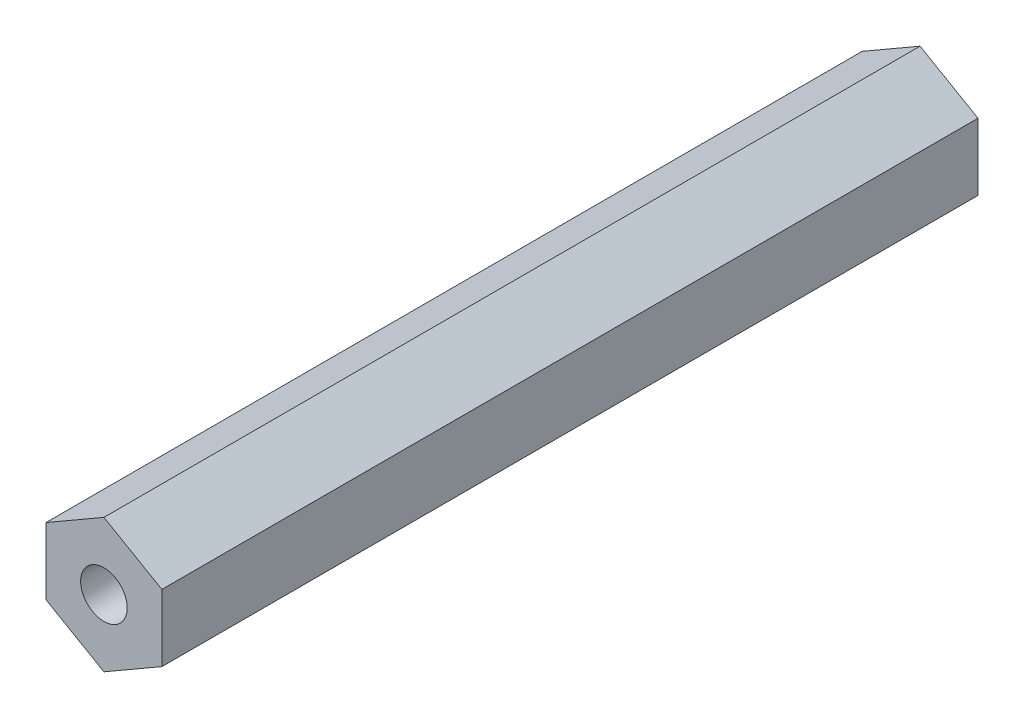
ISO-10303-21;
HEADER;
FILE_DESCRIPTION(('STEP AP214'),'2;1');
FILE_NAME('part.step','',(''),(''),'','','');
FILE_SCHEMA(('AUTOMOTIVE_DESIGN { 1 0 10303 214 1 1 1 1 }'));
ENDSEC;
DATA;
#1=APPLICATION_CONTEXT('core data for automotive mechanical design processes');
#2=APPLICATION_PROTOCOL_DEFINITION('international standard','automotive_design',2000,#1);
#3=PRODUCT_CONTEXT('',#1,'mechanical');
#4=PRODUCT('Part','Part','',(#3));
#5=PRODUCT_RELATED_PRODUCT_CATEGORY('part','',(#4));
#6=PRODUCT_DEFINITION_FORMATION('','',#4);
#7=PRODUCT_DEFINITION_CONTEXT('part definition',#1,'design');
#8=PRODUCT_DEFINITION('design','',#6,#7);
#9=PRODUCT_DEFINITION_SHAPE('','',#8);
#10=(LENGTH_UNIT() NAMED_UNIT(*) SI_UNIT(.MILLI.,.METRE.));
#11=(NAMED_UNIT(*) PLANE_ANGLE_UNIT() SI_UNIT($,.RADIAN.));
#12=(NAMED_UNIT(*) SI_UNIT($,.STERADIAN.) SOLID_ANGLE_UNIT());
#13=UNCERTAINTY_MEASURE_WITH_UNIT(LENGTH_MEASURE(1.E-05),#10,'distance_accuracy_value','');
#14=(GEOMETRIC_REPRESENTATION_CONTEXT(3) GLOBAL_UNCERTAINTY_ASSIGNED_CONTEXT((#13)) GLOBAL_UNIT_ASSIGNED_CONTEXT((#10,
#11,#12)) REPRESENTATION_CONTEXT('',''));
#15=CARTESIAN_POINT('',(0.,0.,0.));
#16=DIRECTION('',(0.,0.,1.));
#17=DIRECTION('',(1.,0.,0.));
#18=AXIS2_PLACEMENT_3D('',#15,#16,#17);
#19=CARTESIAN_POINT('',(6.34999999999999,3.66617420935413,44.73702));
#20=DIRECTION('',(-0.5,-0.866025403784439,0.));
#21=DIRECTION('',(0.866025403784439,-0.5,0.));
#22=AXIS2_PLACEMENT_3D('',#19,#20,#21);
#23=PLANE('',#22);
#24=DIRECTION('',(0.,0.,-1.));
#25=VECTOR('',#24,1.);
#26=CARTESIAN_POINT('',(6.34999999999999,3.66617420935413,44.73702));
#27=LINE('',#26,#25);
#28=CARTESIAN_POINT('',(6.34999999999999,3.66617420935413,44.73702));
#29=VERTEX_POINT('',#28);
#30=CARTESIAN_POINT('',(6.34999999999999,3.66617420935413,-44.73702));
#31=VERTEX_POINT('',#30);
#32=EDGE_CURVE('E145',#29,#31,#27,.T.);
#33=ORIENTED_EDGE('',*,*,#32,.T.);
#34=DIRECTION('',(-0.866025403784438,0.5,0.));
#35=VECTOR('',#34,1.);
#36=CARTESIAN_POINT('',(6.34999999999999,3.66617420935413,-44.73702));
#37=LINE('',#36,#35);
#38=CARTESIAN_POINT('',(0.,7.33234841870825,-44.73702));
#39=VERTEX_POINT('',#38);
#40=EDGE_CURVE('E117',#31,#39,#37,.T.);
#41=ORIENTED_EDGE('',*,*,#40,.T.);
#42=DIRECTION('',(0.,0.,-1.));
#43=VECTOR('',#42,1.);
#44=CARTESIAN_POINT('',(0.,7.33234841870825,44.73702));
#45=LINE('',#44,#43);
#46=CARTESIAN_POINT('',(0.,7.33234841870825,44.73702));
#47=VERTEX_POINT('',#46);
#48=EDGE_CURVE('E11',#47,#39,#45,.T.);
#49=ORIENTED_EDGE('',*,*,#48,.F.);
#50=DIRECTION('',(-0.866025403784438,0.5,0.));
#51=VECTOR('',#50,1.);
#52=CARTESIAN_POINT('',(6.34999999999999,3.66617420935413,44.73702));
#53=LINE('',#52,#51);
#54=EDGE_CURVE('E135',#29,#47,#53,.T.);
#55=ORIENTED_EDGE('',*,*,#54,.F.);
#56=EDGE_LOOP('',(#33,#41,#49,#55));
#57=FACE_BOUND('',#56,.T.);
#58=ADVANCED_FACE('F41',(#57),#23,.F.);
#59=CARTESIAN_POINT('',(0.,7.33234841870825,44.73702));
#60=DIRECTION('',(0.5,-0.866025403784439,0.));
#61=DIRECTION('',(0.866025403784439,0.5,0.));
#62=AXIS2_PLACEMENT_3D('',#59,#60,#61);
#63=PLANE('',#62);
#64=ORIENTED_EDGE('',*,*,#48,.T.);
#65=DIRECTION('',(-0.866025403784439,-0.5,0.));
#66=VECTOR('',#65,1.);
#67=CARTESIAN_POINT('',(0.,7.33234841870825,-44.73702));
#68=LINE('',#67,#66);
#69=CARTESIAN_POINT('',(-6.35,3.66617420935413,-44.73702));
#70=VERTEX_POINT('',#69);
#71=EDGE_CURVE('E120',#39,#70,#68,.T.);
#72=ORIENTED_EDGE('',*,*,#71,.T.);
#73=DIRECTION('',(0.,0.,-1.));
#74=VECTOR('',#73,1.);
#75=CARTESIAN_POINT('',(-6.35,3.66617420935413,44.73702));
#76=LINE('',#75,#74);
#77=CARTESIAN_POINT('',(-6.35,3.66617420935413,44.73702));
#78=VERTEX_POINT('',#77);
#79=EDGE_CURVE('E48',#78,#70,#76,.T.);
#80=ORIENTED_EDGE('',*,*,#79,.F.);
#81=DIRECTION('',(-0.866025403784439,-0.5,0.));
#82=VECTOR('',#81,1.);
#83=CARTESIAN_POINT('',(0.,7.33234841870825,44.73702));
#84=LINE('',#83,#82);
#85=EDGE_CURVE('E137',#47,#78,#84,.T.);
#86=ORIENTED_EDGE('',*,*,#85,.F.);
#87=EDGE_LOOP('',(#64,#72,#80,#86));
#88=FACE_BOUND('',#87,.T.);
#89=ADVANCED_FACE('F165',(#88),#63,.F.);
#90=CARTESIAN_POINT('',(-6.35,3.66617420935413,44.73702));
#91=DIRECTION('',(1.,0.,0.));
#92=DIRECTION('',(0.,0.,-1.));
#93=AXIS2_PLACEMENT_3D('',#90,#91,#92);
#94=PLANE('',#93);
#95=ORIENTED_EDGE('',*,*,#79,.T.);
#96=DIRECTION('',(0.,-1.,0.));
#97=VECTOR('',#96,1.);
#98=CARTESIAN_POINT('',(-6.35,3.66617420935413,-44.73702));
#99=LINE('',#98,#97);
#100=CARTESIAN_POINT('',(-6.35,-3.66617420935413,-44.73702));
#101=VERTEX_POINT('',#100);
#102=EDGE_CURVE('E123',#70,#101,#99,.T.);
#103=ORIENTED_EDGE('',*,*,#102,.T.);
#104=DIRECTION('',(0.,0.,-1.));
#105=VECTOR('',#104,1.);
#106=CARTESIAN_POINT('',(-6.35,-3.66617420935413,44.73702));
#107=LINE('',#106,#105);
#108=CARTESIAN_POINT('',(-6.35,-3.66617420935413,44.73702));
#109=VERTEX_POINT('',#108);
#110=EDGE_CURVE('E151',#109,#101,#107,.T.);
#111=ORIENTED_EDGE('',*,*,#110,.F.);
#112=DIRECTION('',(0.,-1.,0.));
#113=VECTOR('',#112,1.);
#114=CARTESIAN_POINT('',(-6.35,3.66617420935413,44.73702));
#115=LINE('',#114,#113);
#116=EDGE_CURVE('E139',#78,#109,#115,.T.);
#117=ORIENTED_EDGE('',*,*,#116,.F.);
#118=EDGE_LOOP('',(#95,#103,#111,#117));
#119=FACE_BOUND('',#118,.T.);
#120=ADVANCED_FACE('F156',(#119),#94,.F.);
#121=CARTESIAN_POINT('',(-6.35,-3.66617420935413,44.73702));
#122=DIRECTION('',(0.5,0.866025403784439,0.));
#123=DIRECTION('',(-0.866025403784439,0.5,0.));
#124=AXIS2_PLACEMENT_3D('',#121,#122,#123);
#125=PLANE('',#124);
#126=ORIENTED_EDGE('',*,*,#110,.T.);
#127=DIRECTION('',(0.866025403784439,-0.5,0.));
#128=VECTOR('',#127,1.);
#129=CARTESIAN_POINT('',(-6.35,-3.66617420935413,-44.73702));
#130=LINE('',#129,#128);
#131=CARTESIAN_POINT('',(0.,-7.33234841870825,-44.73702));
#132=VERTEX_POINT('',#131);
#133=EDGE_CURVE('E126',#101,#132,#130,.T.);
#134=ORIENTED_EDGE('',*,*,#133,.T.);
#135=DIRECTION('',(0.,0.,-1.));
#136=VECTOR('',#135,1.);
#137=CARTESIAN_POINT('',(0.,-7.33234841870825,44.73702));
#138=LINE('',#137,#136);
#139=CARTESIAN_POINT('',(0.,-7.33234841870825,44.73702));
#140=VERTEX_POINT('',#139);
#141=EDGE_CURVE('E149',#140,#132,#138,.T.);
#142=ORIENTED_EDGE('',*,*,#141,.F.);
#143=DIRECTION('',(0.866025403784439,-0.5,0.));
#144=VECTOR('',#143,1.);
#145=CARTESIAN_POINT('',(-6.35,-3.66617420935413,44.73702));
#146=LINE('',#145,#144);
#147=EDGE_CURVE('E141',#109,#140,#146,.T.);
#148=ORIENTED_EDGE('',*,*,#147,.F.);
#149=EDGE_LOOP('',(#126,#134,#142,#148));
#150=FACE_BOUND('',#149,.T.);
#151=ADVANCED_FACE('F176',(#150),#125,.F.);
#152=CARTESIAN_POINT('',(0.,-7.33234841870825,44.73702));
#153=DIRECTION('',(-0.5,0.866025403784439,0.));
#154=DIRECTION('',(-0.866025403784439,-0.5,0.));
#155=AXIS2_PLACEMENT_3D('',#152,#153,#154);
#156=PLANE('',#155);
#157=ORIENTED_EDGE('',*,*,#141,.T.);
#158=DIRECTION('',(0.866025403784439,0.5,0.));
#159=VECTOR('',#158,1.);
#160=CARTESIAN_POINT('',(0.,-7.33234841870825,-44.73702));
#161=LINE('',#160,#159);
#162=CARTESIAN_POINT('',(6.34999999999999,-3.66617420935413,-44.73702));
#163=VERTEX_POINT('',#162);
#164=EDGE_CURVE('E129',#132,#163,#161,.T.);
#165=ORIENTED_EDGE('',*,*,#164,.T.);
#166=DIRECTION('',(0.,0.,-1.));
#167=VECTOR('',#166,1.);
#168=CARTESIAN_POINT('',(6.34999999999999,-3.66617420935413,44.73702));
#169=LINE('',#168,#167);
#170=CARTESIAN_POINT('',(6.34999999999999,-3.66617420935413,44.73702));
#171=VERTEX_POINT('',#170);
#172=EDGE_CURVE('E147',#171,#163,#169,.T.);
#173=ORIENTED_EDGE('',*,*,#172,.F.);
#174=DIRECTION('',(0.866025403784439,0.5,0.));
#175=VECTOR('',#174,1.);
#176=CARTESIAN_POINT('',(0.,-7.33234841870825,44.73702));
#177=LINE('',#176,#175);
#178=EDGE_CURVE('E60',#140,#171,#177,.T.);
#179=ORIENTED_EDGE('',*,*,#178,.F.);
#180=EDGE_LOOP('',(#157,#165,#173,#179));
#181=FACE_BOUND('',#180,.T.);
#182=ADVANCED_FACE('F173',(#181),#156,.F.);
#183=CARTESIAN_POINT('',(6.34999999999999,-3.66617420935413,44.73702));
#184=DIRECTION('',(-1.,0.,0.));
#185=DIRECTION('',(0.,-1.,0.));
#186=AXIS2_PLACEMENT_3D('',#183,#184,#185);
#187=PLANE('',#186);
#188=ORIENTED_EDGE('',*,*,#172,.T.);
#189=DIRECTION('',(0.,1.,0.));
#190=VECTOR('',#189,1.);
#191=CARTESIAN_POINT('',(6.34999999999999,-3.66617420935413,-44.73702));
#192=LINE('',#191,#190);
#193=EDGE_CURVE('E132',#163,#31,#192,.T.);
#194=ORIENTED_EDGE('',*,*,#193,.T.);
#195=ORIENTED_EDGE('',*,*,#32,.F.);
#196=DIRECTION('',(0.,1.,0.));
#197=VECTOR('',#196,1.);
#198=CARTESIAN_POINT('',(6.34999999999999,-3.66617420935413,44.73702));
#199=LINE('',#198,#197);
#200=EDGE_CURVE('E55',#171,#29,#199,.T.);
#201=ORIENTED_EDGE('',*,*,#200,.F.);
#202=EDGE_LOOP('',(#188,#194,#195,#201));
#203=FACE_BOUND('',#202,.T.);
#204=ADVANCED_FACE('F171',(#203),#187,.F.);
#205=CARTESIAN_POINT('',(0.,0.,44.73702));
#206=DIRECTION('',(0.,0.,1.));
#207=DIRECTION('',(1.,0.,0.));
#208=AXIS2_PLACEMENT_3D('',#205,#206,#207);
#209=PLANE('',#208);
#210=CARTESIAN_POINT('',(0.,0.,44.73702));
#211=DIRECTION('',(0.,0.,1.));
#212=DIRECTION('',(1.,0.,0.));
#213=AXIS2_PLACEMENT_3D('',#210,#211,#212);
#214=CIRCLE('',#213,2.55269999999999);
#215=CARTESIAN_POINT('',(2.55269999999999,0.,44.73702));
#216=VERTEX_POINT('',#215);
#217=EDGE_CURVE('E107',#216,#216,#214,.T.);
#218=ORIENTED_EDGE('',*,*,#217,.F.);
#219=EDGE_LOOP('',(#218));
#220=FACE_BOUND('',#219,.T.);
#221=ORIENTED_EDGE('',*,*,#54,.T.);
#222=ORIENTED_EDGE('',*,*,#85,.T.);
#223=ORIENTED_EDGE('',*,*,#116,.T.);
#224=ORIENTED_EDGE('',*,*,#147,.T.);
#225=ORIENTED_EDGE('',*,*,#178,.T.);
#226=ORIENTED_EDGE('',*,*,#200,.T.);
#227=EDGE_LOOP('',(#221,#222,#223,#224,#225,#226));
#228=FACE_BOUND('',#227,.T.);
#229=ADVANCED_FACE('F178',(#220,#228),#209,.T.);
#230=CARTESIAN_POINT('',(0.,0.,-44.73702));
#231=DIRECTION('',(0.,0.,1.));
#232=DIRECTION('',(1.,0.,0.));
#233=AXIS2_PLACEMENT_3D('',#230,#231,#232);
#234=PLANE('',#233);
#235=CARTESIAN_POINT('',(0.,0.,-44.73702));
#236=DIRECTION('',(0.,0.,-1.));
#237=DIRECTION('',(-1.,0.,0.));
#238=AXIS2_PLACEMENT_3D('',#235,#236,#237);
#239=CIRCLE('',#238,2.55269999999999);
#240=CARTESIAN_POINT('',(-2.55269999999999,0.,-44.73702));
#241=VERTEX_POINT('',#240);
#242=EDGE_CURVE('E106',#241,#241,#239,.T.);
#243=ORIENTED_EDGE('',*,*,#242,.F.);
#244=EDGE_LOOP('',(#243));
#245=FACE_BOUND('',#244,.T.);
#246=ORIENTED_EDGE('',*,*,#40,.F.);
#247=ORIENTED_EDGE('',*,*,#193,.F.);
#248=ORIENTED_EDGE('',*,*,#164,.F.);
#249=ORIENTED_EDGE('',*,*,#133,.F.);
#250=ORIENTED_EDGE('',*,*,#102,.F.);
#251=ORIENTED_EDGE('',*,*,#71,.F.);
#252=EDGE_LOOP('',(#246,#247,#248,#249,#250,#251));
#253=FACE_BOUND('',#252,.T.);
#254=ADVANCED_FACE('F163',(#245,#253),#234,.F.);
#255=CARTESIAN_POINT('',(0.,0.,-25.68702));
#256=DIRECTION('',(0.,0.,-1.));
#257=DIRECTION('',(-1.,0.,0.));
#258=AXIS2_PLACEMENT_3D('',#255,#256,#257);
#259=CONICAL_SURFACE('',#258,2.5527,1.02974425867665);
#260=CARTESIAN_POINT('',(0.,0.,-24.1532030978084));
#261=VERTEX_POINT('',#260);
#262=VERTEX_LOOP('',#261);
#263=FACE_BOUND('',#262,.T.);
#264=CARTESIAN_POINT('',(0.,0.,-25.68702));
#265=DIRECTION('',(0.,0.,-1.));
#266=DIRECTION('',(-1.,0.,0.));
#267=AXIS2_PLACEMENT_3D('',#264,#265,#266);
#268=CIRCLE('',#267,2.5527);
#269=CARTESIAN_POINT('',(-2.5527,0.,-25.68702));
#270=VERTEX_POINT('',#269);
#271=EDGE_CURVE('E110',#270,#270,#268,.T.);
#272=ORIENTED_EDGE('',*,*,#271,.T.);
#273=EDGE_LOOP('',(#272));
#274=FACE_BOUND('',#273,.T.);
#275=ADVANCED_FACE('F186',(#263,#274),#259,.F.);
#276=CARTESIAN_POINT('',(0.,0.,-44.73702));
#277=DIRECTION('',(0.,0.,-1.));
#278=DIRECTION('',(-1.,0.,0.));
#279=AXIS2_PLACEMENT_3D('',#276,#277,#278);
#280=CYLINDRICAL_SURFACE('',#279,2.55269999999999);
#281=ORIENTED_EDGE('',*,*,#271,.F.);
#282=EDGE_LOOP('',(#281));
#283=FACE_BOUND('',#282,.T.);
#284=ORIENTED_EDGE('',*,*,#242,.T.);
#285=EDGE_LOOP('',(#284));
#286=FACE_BOUND('',#285,.T.);
#287=ADVANCED_FACE('F100',(#283,#286),#280,.F.);
#288=CARTESIAN_POINT('',(0.,0.,25.68702));
#289=DIRECTION('',(0.,0.,1.));
#290=DIRECTION('',(1.,0.,0.));
#291=AXIS2_PLACEMENT_3D('',#288,#289,#290);
#292=CONICAL_SURFACE('',#291,2.55269999999999,1.02974425867665);
#293=CARTESIAN_POINT('',(0.,0.,24.1532030978084));
#294=VERTEX_POINT('',#293);
#295=VERTEX_LOOP('',#294);
#296=FACE_BOUND('',#295,.T.);
#297=CARTESIAN_POINT('',(0.,0.,25.68702));
#298=DIRECTION('',(0.,0.,1.));
#299=DIRECTION('',(1.,0.,0.));
#300=AXIS2_PLACEMENT_3D('',#297,#298,#299);
#301=CIRCLE('',#300,2.55269999999999);
#302=CARTESIAN_POINT('',(2.55269999999999,0.,25.68702));
#303=VERTEX_POINT('',#302);
#304=EDGE_CURVE('E104',#303,#303,#301,.T.);
#305=ORIENTED_EDGE('',*,*,#304,.T.);
#306=EDGE_LOOP('',(#305));
#307=FACE_BOUND('',#306,.T.);
#308=ADVANCED_FACE('F96',(#296,#307),#292,.F.);
#309=CARTESIAN_POINT('',(0.,0.,44.73702));
#310=DIRECTION('',(0.,0.,1.));
#311=DIRECTION('',(1.,0.,0.));
#312=AXIS2_PLACEMENT_3D('',#309,#310,#311);
#313=CYLINDRICAL_SURFACE('',#312,2.55269999999999);
#314=ORIENTED_EDGE('',*,*,#304,.F.);
#315=EDGE_LOOP('',(#314));
#316=FACE_BOUND('',#315,.T.);
#317=ORIENTED_EDGE('',*,*,#217,.T.);
#318=EDGE_LOOP('',(#317));
#319=FACE_BOUND('',#318,.T.);
#320=ADVANCED_FACE('F99',(#316,#319),#313,.F.);
#321=CLOSED_SHELL('',(#58,#89,#120,#151,#182,#204,#229,#254,#275,#287,#308,#320));
#322=MANIFOLD_SOLID_BREP('B2',#321);
#323=ADVANCED_BREP_SHAPE_REPRESENTATION('',(#18,#322),#14);
#324=SHAPE_DEFINITION_REPRESENTATION(#9,#323);
ENDSEC;
END-ISO-10303-21;
